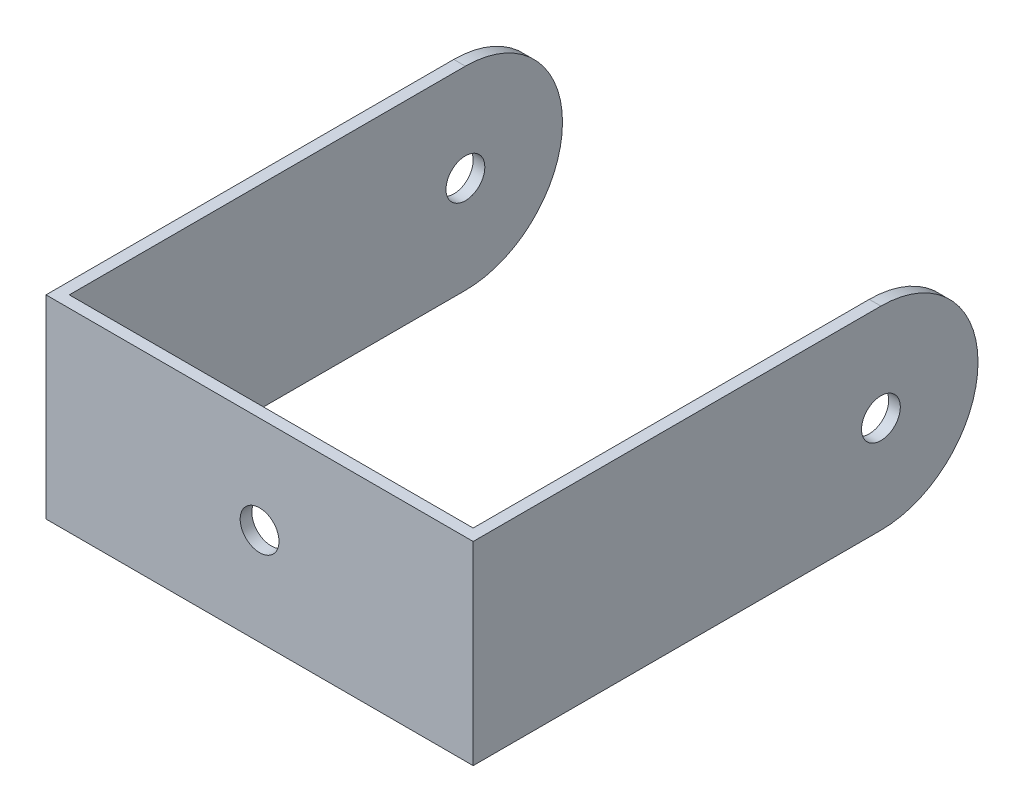
ISO-10303-21;
HEADER;
FILE_DESCRIPTION(('STEP AP214'),'2;1');
FILE_NAME('part.step','',(''),(''),'','','');
FILE_SCHEMA(('AUTOMOTIVE_DESIGN { 1 0 10303 214 1 1 1 1 }'));
ENDSEC;
DATA;
#1=APPLICATION_CONTEXT('core data for automotive mechanical design processes');
#2=APPLICATION_PROTOCOL_DEFINITION('international standard','automotive_design',2000,#1);
#3=PRODUCT_CONTEXT('',#1,'mechanical');
#4=PRODUCT('Part','Part','',(#3));
#5=PRODUCT_RELATED_PRODUCT_CATEGORY('part','',(#4));
#6=PRODUCT_DEFINITION_FORMATION('','',#4);
#7=PRODUCT_DEFINITION_CONTEXT('part definition',#1,'design');
#8=PRODUCT_DEFINITION('design','',#6,#7);
#9=PRODUCT_DEFINITION_SHAPE('','',#8);
#10=(LENGTH_UNIT() NAMED_UNIT(*) SI_UNIT(.MILLI.,.METRE.));
#11=(NAMED_UNIT(*) PLANE_ANGLE_UNIT() SI_UNIT($,.RADIAN.));
#12=(NAMED_UNIT(*) SI_UNIT($,.STERADIAN.) SOLID_ANGLE_UNIT());
#13=UNCERTAINTY_MEASURE_WITH_UNIT(LENGTH_MEASURE(1.E-05),#10,'distance_accuracy_value','');
#14=(GEOMETRIC_REPRESENTATION_CONTEXT(3) GLOBAL_UNCERTAINTY_ASSIGNED_CONTEXT((#13)) GLOBAL_UNIT_ASSIGNED_CONTEXT((#10,
#11,#12)) REPRESENTATION_CONTEXT('',''));
#15=CARTESIAN_POINT('',(0.,0.,0.));
#16=DIRECTION('',(0.,0.,1.));
#17=DIRECTION('',(1.,0.,0.));
#18=AXIS2_PLACEMENT_3D('',#15,#16,#17);
#19=CARTESIAN_POINT('',(-27.5,12.5,32.5));
#20=DIRECTION('',(1.,0.,0.));
#21=DIRECTION('',(0.,0.,-1.));
#22=AXIS2_PLACEMENT_3D('',#19,#20,#21);
#23=PLANE('',#22);
#24=CARTESIAN_POINT('',(-27.5,0.,-20.));
#25=DIRECTION('',(1.,0.,0.));
#26=DIRECTION('',(0.,0.,-1.));
#27=AXIS2_PLACEMENT_3D('',#24,#25,#26);
#28=CIRCLE('',#27,2.5);
#29=CARTESIAN_POINT('',(-27.5,0.,-22.5));
#30=VERTEX_POINT('',#29);
#31=EDGE_CURVE('E193',#30,#30,#28,.T.);
#32=ORIENTED_EDGE('',*,*,#31,.T.);
#33=EDGE_LOOP('',(#32));
#34=FACE_BOUND('',#33,.T.);
#35=CARTESIAN_POINT('',(-27.5,0.,-20.));
#36=DIRECTION('',(1.,0.,0.));
#37=DIRECTION('',(0.,0.,-1.));
#38=AXIS2_PLACEMENT_3D('',#35,#36,#37);
#39=CIRCLE('',#38,12.5);
#40=CARTESIAN_POINT('',(-27.5,12.5,-20.));
#41=VERTEX_POINT('',#40);
#42=CARTESIAN_POINT('',(-27.5,0.,-32.5));
#43=VERTEX_POINT('',#42);
#44=EDGE_CURVE('E130',#41,#43,#39,.F.);
#45=ORIENTED_EDGE('',*,*,#44,.T.);
#46=CARTESIAN_POINT('',(-27.5,0.,-20.));
#47=DIRECTION('',(1.,0.,0.));
#48=DIRECTION('',(0.,0.,-1.));
#49=AXIS2_PLACEMENT_3D('',#46,#47,#48);
#50=CIRCLE('',#49,12.5);
#51=CARTESIAN_POINT('',(-27.5,-12.5,-20.));
#52=VERTEX_POINT('',#51);
#53=EDGE_CURVE('E167',#43,#52,#50,.F.);
#54=ORIENTED_EDGE('',*,*,#53,.T.);
#55=DIRECTION('',(0.,0.,1.));
#56=VECTOR('',#55,1.);
#57=CARTESIAN_POINT('',(-27.5,-12.5,32.5));
#58=LINE('',#57,#56);
#59=CARTESIAN_POINT('',(-27.5,-12.5,32.5));
#60=VERTEX_POINT('',#59);
#61=EDGE_CURVE('E127',#52,#60,#58,.T.);
#62=ORIENTED_EDGE('',*,*,#61,.T.);
#63=DIRECTION('',(0.,-1.,0.));
#64=VECTOR('',#63,1.);
#65=CARTESIAN_POINT('',(-27.5,12.5,32.5));
#66=LINE('',#65,#64);
#67=CARTESIAN_POINT('',(-27.5,12.5,32.5));
#68=VERTEX_POINT('',#67);
#69=EDGE_CURVE('E125',#68,#60,#66,.T.);
#70=ORIENTED_EDGE('',*,*,#69,.F.);
#71=DIRECTION('',(0.,0.,1.));
#72=VECTOR('',#71,1.);
#73=CARTESIAN_POINT('',(-27.5,12.5,32.5));
#74=LINE('',#73,#72);
#75=EDGE_CURVE('E110',#41,#68,#74,.T.);
#76=ORIENTED_EDGE('',*,*,#75,.F.);
#77=EDGE_LOOP('',(#45,#54,#62,#70,#76));
#78=FACE_BOUND('',#77,.T.);
#79=ADVANCED_FACE('F33',(#34,#78),#23,.F.);
#80=CARTESIAN_POINT('',(27.5,12.5,32.5));
#81=DIRECTION('',(0.,0.,-1.));
#82=DIRECTION('',(-1.,0.,0.));
#83=AXIS2_PLACEMENT_3D('',#80,#81,#82);
#84=PLANE('',#83);
#85=CARTESIAN_POINT('',(0.,0.,32.5));
#86=DIRECTION('',(0.,0.,1.));
#87=DIRECTION('',(1.,0.,0.));
#88=AXIS2_PLACEMENT_3D('',#85,#86,#87);
#89=CIRCLE('',#88,2.5);
#90=CARTESIAN_POINT('',(2.5,0.,32.5));
#91=VERTEX_POINT('',#90);
#92=EDGE_CURVE('E205',#91,#91,#89,.T.);
#93=ORIENTED_EDGE('',*,*,#92,.F.);
#94=EDGE_LOOP('',(#93));
#95=FACE_BOUND('',#94,.T.);
#96=DIRECTION('',(1.,0.,0.));
#97=VECTOR('',#96,1.);
#98=CARTESIAN_POINT('',(27.5,-12.5,32.5));
#99=LINE('',#98,#97);
#100=CARTESIAN_POINT('',(27.5,-12.5,32.5));
#101=VERTEX_POINT('',#100);
#102=EDGE_CURVE('E149',#60,#101,#99,.T.);
#103=ORIENTED_EDGE('',*,*,#102,.T.);
#104=DIRECTION('',(0.,-1.,0.));
#105=VECTOR('',#104,1.);
#106=CARTESIAN_POINT('',(27.5,12.5,32.5));
#107=LINE('',#106,#105);
#108=CARTESIAN_POINT('',(27.5,12.5,32.5));
#109=VERTEX_POINT('',#108);
#110=EDGE_CURVE('E131',#109,#101,#107,.T.);
#111=ORIENTED_EDGE('',*,*,#110,.F.);
#112=DIRECTION('',(1.,0.,0.));
#113=VECTOR('',#112,1.);
#114=CARTESIAN_POINT('',(27.5,12.5,32.5));
#115=LINE('',#114,#113);
#116=EDGE_CURVE('E116',#68,#109,#115,.T.);
#117=ORIENTED_EDGE('',*,*,#116,.F.);
#118=ORIENTED_EDGE('',*,*,#69,.T.);
#119=EDGE_LOOP('',(#103,#111,#117,#118));
#120=FACE_BOUND('',#119,.T.);
#121=ADVANCED_FACE('F133',(#95,#120),#84,.F.);
#122=CARTESIAN_POINT('',(27.5,12.5,32.5));
#123=DIRECTION('',(-1.,0.,0.));
#124=DIRECTION('',(0.,0.,1.));
#125=AXIS2_PLACEMENT_3D('',#122,#123,#124);
#126=PLANE('',#125);
#127=CARTESIAN_POINT('',(27.5,0.,-20.));
#128=DIRECTION('',(1.,0.,0.));
#129=DIRECTION('',(0.,0.,-1.));
#130=AXIS2_PLACEMENT_3D('',#127,#128,#129);
#131=CIRCLE('',#130,2.5);
#132=CARTESIAN_POINT('',(27.5,0.,-22.5));
#133=VERTEX_POINT('',#132);
#134=EDGE_CURVE('E198',#133,#133,#131,.T.);
#135=ORIENTED_EDGE('',*,*,#134,.F.);
#136=EDGE_LOOP('',(#135));
#137=FACE_BOUND('',#136,.T.);
#138=DIRECTION('',(0.,0.,-1.));
#139=VECTOR('',#138,1.);
#140=CARTESIAN_POINT('',(27.5,-12.5,32.5));
#141=LINE('',#140,#139);
#142=CARTESIAN_POINT('',(27.5,-12.5,-20.));
#143=VERTEX_POINT('',#142);
#144=EDGE_CURVE('E152',#101,#143,#141,.T.);
#145=ORIENTED_EDGE('',*,*,#144,.T.);
#146=CARTESIAN_POINT('',(27.5,0.,-20.));
#147=DIRECTION('',(-1.,0.,0.));
#148=DIRECTION('',(0.,0.,1.));
#149=AXIS2_PLACEMENT_3D('',#146,#147,#148);
#150=CIRCLE('',#149,12.5);
#151=CARTESIAN_POINT('',(27.5,0.,-32.5));
#152=VERTEX_POINT('',#151);
#153=EDGE_CURVE('E11',#143,#152,#150,.F.);
#154=ORIENTED_EDGE('',*,*,#153,.T.);
#155=CARTESIAN_POINT('',(27.5,0.,-20.));
#156=DIRECTION('',(-1.,0.,0.));
#157=DIRECTION('',(0.,0.,1.));
#158=AXIS2_PLACEMENT_3D('',#155,#156,#157);
#159=CIRCLE('',#158,12.5);
#160=CARTESIAN_POINT('',(27.5,12.5,-20.));
#161=VERTEX_POINT('',#160);
#162=EDGE_CURVE('E42',#152,#161,#159,.F.);
#163=ORIENTED_EDGE('',*,*,#162,.T.);
#164=DIRECTION('',(0.,0.,-1.));
#165=VECTOR('',#164,1.);
#166=CARTESIAN_POINT('',(27.5,12.5,32.5));
#167=LINE('',#166,#165);
#168=EDGE_CURVE('E136',#109,#161,#167,.T.);
#169=ORIENTED_EDGE('',*,*,#168,.F.);
#170=ORIENTED_EDGE('',*,*,#110,.T.);
#171=EDGE_LOOP('',(#145,#154,#163,#169,#170));
#172=FACE_BOUND('',#171,.T.);
#173=ADVANCED_FACE('F231',(#137,#172),#126,.F.);
#174=CARTESIAN_POINT('',(26.,12.5,31.));
#175=DIRECTION('',(1.,0.,0.));
#176=DIRECTION('',(0.,0.,-1.));
#177=AXIS2_PLACEMENT_3D('',#174,#175,#176);
#178=PLANE('',#177);
#179=CARTESIAN_POINT('',(26.,0.,-20.));
#180=DIRECTION('',(1.,0.,0.));
#181=DIRECTION('',(0.,0.,-1.));
#182=AXIS2_PLACEMENT_3D('',#179,#180,#181);
#183=CIRCLE('',#182,2.5);
#184=CARTESIAN_POINT('',(26.,0.,-22.5));
#185=VERTEX_POINT('',#184);
#186=EDGE_CURVE('E190',#185,#185,#183,.T.);
#187=ORIENTED_EDGE('',*,*,#186,.T.);
#188=EDGE_LOOP('',(#187));
#189=FACE_BOUND('',#188,.T.);
#190=CARTESIAN_POINT('',(26.,0.,-20.));
#191=DIRECTION('',(1.,0.,0.));
#192=DIRECTION('',(0.,0.,-1.));
#193=AXIS2_PLACEMENT_3D('',#190,#191,#192);
#194=CIRCLE('',#193,12.5);
#195=CARTESIAN_POINT('',(26.,12.5,-20.));
#196=VERTEX_POINT('',#195);
#197=CARTESIAN_POINT('',(26.,0.,-32.5));
#198=VERTEX_POINT('',#197);
#199=EDGE_CURVE('E56',#196,#198,#194,.F.);
#200=ORIENTED_EDGE('',*,*,#199,.T.);
#201=CARTESIAN_POINT('',(26.,0.,-20.));
#202=DIRECTION('',(1.,0.,0.));
#203=DIRECTION('',(0.,0.,-1.));
#204=AXIS2_PLACEMENT_3D('',#201,#202,#203);
#205=CIRCLE('',#204,12.5);
#206=CARTESIAN_POINT('',(26.,-12.5,-20.));
#207=VERTEX_POINT('',#206);
#208=EDGE_CURVE('E183',#198,#207,#205,.F.);
#209=ORIENTED_EDGE('',*,*,#208,.T.);
#210=DIRECTION('',(0.,0.,1.));
#211=VECTOR('',#210,1.);
#212=CARTESIAN_POINT('',(26.,-12.5,31.));
#213=LINE('',#212,#211);
#214=CARTESIAN_POINT('',(26.,-12.5,31.));
#215=VERTEX_POINT('',#214);
#216=EDGE_CURVE('E154',#207,#215,#213,.T.);
#217=ORIENTED_EDGE('',*,*,#216,.T.);
#218=DIRECTION('',(0.,-1.,0.));
#219=VECTOR('',#218,1.);
#220=CARTESIAN_POINT('',(26.,12.5,31.));
#221=LINE('',#220,#219);
#222=CARTESIAN_POINT('',(26.,12.5,31.));
#223=VERTEX_POINT('',#222);
#224=EDGE_CURVE('E162',#223,#215,#221,.T.);
#225=ORIENTED_EDGE('',*,*,#224,.F.);
#226=DIRECTION('',(0.,0.,1.));
#227=VECTOR('',#226,1.);
#228=CARTESIAN_POINT('',(26.,12.5,31.));
#229=LINE('',#228,#227);
#230=EDGE_CURVE('E138',#196,#223,#229,.T.);
#231=ORIENTED_EDGE('',*,*,#230,.F.);
#232=EDGE_LOOP('',(#200,#209,#217,#225,#231));
#233=FACE_BOUND('',#232,.T.);
#234=ADVANCED_FACE('F260',(#189,#233),#178,.F.);
#235=CARTESIAN_POINT('',(26.,12.5,31.));
#236=DIRECTION('',(0.,0.,1.));
#237=DIRECTION('',(1.,0.,0.));
#238=AXIS2_PLACEMENT_3D('',#235,#236,#237);
#239=PLANE('',#238);
#240=CARTESIAN_POINT('',(0.,0.,31.));
#241=DIRECTION('',(0.,0.,1.));
#242=DIRECTION('',(1.,0.,0.));
#243=AXIS2_PLACEMENT_3D('',#240,#241,#242);
#244=CIRCLE('',#243,2.5);
#245=CARTESIAN_POINT('',(2.5,0.,31.));
#246=VERTEX_POINT('',#245);
#247=EDGE_CURVE('E37',#246,#246,#244,.T.);
#248=ORIENTED_EDGE('',*,*,#247,.T.);
#249=EDGE_LOOP('',(#248));
#250=FACE_BOUND('',#249,.T.);
#251=DIRECTION('',(-1.,0.,0.));
#252=VECTOR('',#251,1.);
#253=CARTESIAN_POINT('',(26.,-12.5,31.));
#254=LINE('',#253,#252);
#255=CARTESIAN_POINT('',(-26.,-12.5,31.));
#256=VERTEX_POINT('',#255);
#257=EDGE_CURVE('E156',#215,#256,#254,.T.);
#258=ORIENTED_EDGE('',*,*,#257,.T.);
#259=DIRECTION('',(0.,-1.,0.));
#260=VECTOR('',#259,1.);
#261=CARTESIAN_POINT('',(-26.,12.5,31.));
#262=LINE('',#261,#260);
#263=CARTESIAN_POINT('',(-26.,12.5,31.));
#264=VERTEX_POINT('',#263);
#265=EDGE_CURVE('E147',#264,#256,#262,.T.);
#266=ORIENTED_EDGE('',*,*,#265,.F.);
#267=DIRECTION('',(-1.,0.,0.));
#268=VECTOR('',#267,1.);
#269=CARTESIAN_POINT('',(26.,12.5,31.));
#270=LINE('',#269,#268);
#271=EDGE_CURVE('E143',#223,#264,#270,.T.);
#272=ORIENTED_EDGE('',*,*,#271,.F.);
#273=ORIENTED_EDGE('',*,*,#224,.T.);
#274=EDGE_LOOP('',(#258,#266,#272,#273));
#275=FACE_BOUND('',#274,.T.);
#276=ADVANCED_FACE('F212',(#250,#275),#239,.F.);
#277=CARTESIAN_POINT('',(-26.,12.5,31.));
#278=DIRECTION('',(-1.,0.,0.));
#279=DIRECTION('',(0.,0.,1.));
#280=AXIS2_PLACEMENT_3D('',#277,#278,#279);
#281=PLANE('',#280);
#282=CARTESIAN_POINT('',(-26.,0.,-20.));
#283=DIRECTION('',(-1.,0.,0.));
#284=DIRECTION('',(0.,0.,1.));
#285=AXIS2_PLACEMENT_3D('',#282,#283,#284);
#286=CIRCLE('',#285,2.5);
#287=CARTESIAN_POINT('',(-26.,0.,-17.5));
#288=VERTEX_POINT('',#287);
#289=EDGE_CURVE('E191',#288,#288,#286,.T.);
#290=ORIENTED_EDGE('',*,*,#289,.T.);
#291=EDGE_LOOP('',(#290));
#292=FACE_BOUND('',#291,.T.);
#293=DIRECTION('',(0.,0.,-1.));
#294=VECTOR('',#293,1.);
#295=CARTESIAN_POINT('',(-26.,-12.5,31.));
#296=LINE('',#295,#294);
#297=CARTESIAN_POINT('',(-26.,-12.5,-20.));
#298=VERTEX_POINT('',#297);
#299=EDGE_CURVE('E122',#256,#298,#296,.T.);
#300=ORIENTED_EDGE('',*,*,#299,.T.);
#301=CARTESIAN_POINT('',(-26.,0.,-20.));
#302=DIRECTION('',(-1.,0.,0.));
#303=DIRECTION('',(0.,0.,1.));
#304=AXIS2_PLACEMENT_3D('',#301,#302,#303);
#305=CIRCLE('',#304,12.5);
#306=CARTESIAN_POINT('',(-26.,0.,-32.5));
#307=VERTEX_POINT('',#306);
#308=EDGE_CURVE('E177',#298,#307,#305,.F.);
#309=ORIENTED_EDGE('',*,*,#308,.T.);
#310=CARTESIAN_POINT('',(-26.,0.,-20.));
#311=DIRECTION('',(-1.,0.,0.));
#312=DIRECTION('',(0.,0.,1.));
#313=AXIS2_PLACEMENT_3D('',#310,#311,#312);
#314=CIRCLE('',#313,12.5);
#315=CARTESIAN_POINT('',(-26.,12.5,-20.));
#316=VERTEX_POINT('',#315);
#317=EDGE_CURVE('E175',#307,#316,#314,.F.);
#318=ORIENTED_EDGE('',*,*,#317,.T.);
#319=DIRECTION('',(0.,0.,-1.));
#320=VECTOR('',#319,1.);
#321=CARTESIAN_POINT('',(-26.,12.5,31.));
#322=LINE('',#321,#320);
#323=EDGE_CURVE('E145',#264,#316,#322,.T.);
#324=ORIENTED_EDGE('',*,*,#323,.F.);
#325=ORIENTED_EDGE('',*,*,#265,.T.);
#326=EDGE_LOOP('',(#300,#309,#318,#324,#325));
#327=FACE_BOUND('',#326,.T.);
#328=ADVANCED_FACE('F267',(#292,#327),#281,.F.);
#329=CARTESIAN_POINT('',(0.,12.5,0.));
#330=DIRECTION('',(0.,1.,0.));
#331=DIRECTION('',(0.,0.,1.));
#332=AXIS2_PLACEMENT_3D('',#329,#330,#331);
#333=PLANE('',#332);
#334=ORIENTED_EDGE('',*,*,#323,.T.);
#335=DIRECTION('',(-1.,0.,0.));
#336=VECTOR('',#335,1.);
#337=CARTESIAN_POINT('',(-27.5,12.5,-20.));
#338=LINE('',#337,#336);
#339=EDGE_CURVE('E119',#316,#41,#338,.T.);
#340=ORIENTED_EDGE('',*,*,#339,.T.);
#341=ORIENTED_EDGE('',*,*,#75,.T.);
#342=ORIENTED_EDGE('',*,*,#116,.T.);
#343=ORIENTED_EDGE('',*,*,#168,.T.);
#344=DIRECTION('',(-1.,0.,0.));
#345=VECTOR('',#344,1.);
#346=CARTESIAN_POINT('',(26.,12.5,-20.));
#347=LINE('',#346,#345);
#348=EDGE_CURVE('E179',#161,#196,#347,.T.);
#349=ORIENTED_EDGE('',*,*,#348,.T.);
#350=ORIENTED_EDGE('',*,*,#230,.T.);
#351=ORIENTED_EDGE('',*,*,#271,.T.);
#352=EDGE_LOOP('',(#334,#340,#341,#342,#343,#349,#350,#351));
#353=FACE_BOUND('',#352,.T.);
#354=ADVANCED_FACE('F113',(#353),#333,.T.);
#355=CARTESIAN_POINT('',(0.,-12.5,0.));
#356=DIRECTION('',(0.,1.,0.));
#357=DIRECTION('',(0.,0.,1.));
#358=AXIS2_PLACEMENT_3D('',#355,#356,#357);
#359=PLANE('',#358);
#360=ORIENTED_EDGE('',*,*,#61,.F.);
#361=DIRECTION('',(-1.,0.,0.));
#362=VECTOR('',#361,1.);
#363=CARTESIAN_POINT('',(0.,-12.5,-20.));
#364=LINE('',#363,#362);
#365=EDGE_CURVE('E172',#52,#298,#364,.F.);
#366=ORIENTED_EDGE('',*,*,#365,.T.);
#367=ORIENTED_EDGE('',*,*,#299,.F.);
#368=ORIENTED_EDGE('',*,*,#257,.F.);
#369=ORIENTED_EDGE('',*,*,#216,.F.);
#370=DIRECTION('',(-1.,0.,0.));
#371=VECTOR('',#370,1.);
#372=CARTESIAN_POINT('',(0.,-12.5,-20.));
#373=LINE('',#372,#371);
#374=EDGE_CURVE('E169',#207,#143,#373,.F.);
#375=ORIENTED_EDGE('',*,*,#374,.T.);
#376=ORIENTED_EDGE('',*,*,#144,.F.);
#377=ORIENTED_EDGE('',*,*,#102,.F.);
#378=EDGE_LOOP('',(#360,#366,#367,#368,#369,#375,#376,#377));
#379=FACE_BOUND('',#378,.T.);
#380=ADVANCED_FACE('F242',(#379),#359,.F.);
#381=CARTESIAN_POINT('',(0.,0.,-20.));
#382=DIRECTION('',(1.,0.,0.));
#383=DIRECTION('',(0.,0.,-1.));
#384=AXIS2_PLACEMENT_3D('',#381,#382,#383);
#385=CYLINDRICAL_SURFACE('',#384,12.5);
#386=ORIENTED_EDGE('',*,*,#339,.F.);
#387=ORIENTED_EDGE('',*,*,#317,.F.);
#388=DIRECTION('',(-1.,0.,0.));
#389=VECTOR('',#388,1.);
#390=CARTESIAN_POINT('',(-26.,0.,-32.5));
#391=LINE('',#390,#389);
#392=EDGE_CURVE('E150',#43,#307,#391,.F.);
#393=ORIENTED_EDGE('',*,*,#392,.F.);
#394=ORIENTED_EDGE('',*,*,#44,.F.);
#395=EDGE_LOOP('',(#386,#387,#393,#394));
#396=FACE_BOUND('',#395,.T.);
#397=ADVANCED_FACE('F239',(#396),#385,.T.);
#398=CARTESIAN_POINT('',(-27.5,0.,-20.));
#399=DIRECTION('',(-1.,0.,0.));
#400=DIRECTION('',(0.,0.,1.));
#401=AXIS2_PLACEMENT_3D('',#398,#399,#400);
#402=CYLINDRICAL_SURFACE('',#401,12.5);
#403=ORIENTED_EDGE('',*,*,#308,.F.);
#404=ORIENTED_EDGE('',*,*,#365,.F.);
#405=ORIENTED_EDGE('',*,*,#53,.F.);
#406=ORIENTED_EDGE('',*,*,#392,.T.);
#407=EDGE_LOOP('',(#403,#404,#405,#406));
#408=FACE_BOUND('',#407,.T.);
#409=ADVANCED_FACE('F236',(#408),#402,.T.);
#410=CARTESIAN_POINT('',(0.,0.,-20.));
#411=DIRECTION('',(1.,0.,0.));
#412=DIRECTION('',(0.,0.,-1.));
#413=AXIS2_PLACEMENT_3D('',#410,#411,#412);
#414=CYLINDRICAL_SURFACE('',#413,12.5);
#415=ORIENTED_EDGE('',*,*,#348,.F.);
#416=ORIENTED_EDGE('',*,*,#162,.F.);
#417=DIRECTION('',(-1.,0.,0.));
#418=VECTOR('',#417,1.);
#419=CARTESIAN_POINT('',(27.5,0.,-32.5));
#420=LINE('',#419,#418);
#421=EDGE_CURVE('E188',#198,#152,#420,.F.);
#422=ORIENTED_EDGE('',*,*,#421,.F.);
#423=ORIENTED_EDGE('',*,*,#199,.F.);
#424=EDGE_LOOP('',(#415,#416,#422,#423));
#425=FACE_BOUND('',#424,.T.);
#426=ADVANCED_FACE('F35',(#425),#414,.T.);
#427=CARTESIAN_POINT('',(26.,0.,-20.));
#428=DIRECTION('',(-1.,0.,0.));
#429=DIRECTION('',(0.,0.,1.));
#430=AXIS2_PLACEMENT_3D('',#427,#428,#429);
#431=CYLINDRICAL_SURFACE('',#430,12.5);
#432=ORIENTED_EDGE('',*,*,#153,.F.);
#433=ORIENTED_EDGE('',*,*,#374,.F.);
#434=ORIENTED_EDGE('',*,*,#208,.F.);
#435=ORIENTED_EDGE('',*,*,#421,.T.);
#436=EDGE_LOOP('',(#432,#433,#434,#435));
#437=FACE_BOUND('',#436,.T.);
#438=ADVANCED_FACE('F244',(#437),#431,.T.);
#439=CARTESIAN_POINT('',(-27.5,0.,-20.));
#440=DIRECTION('',(1.,0.,0.));
#441=DIRECTION('',(0.,0.,-1.));
#442=AXIS2_PLACEMENT_3D('',#439,#440,#441);
#443=CYLINDRICAL_SURFACE('',#442,2.5);
#444=ORIENTED_EDGE('',*,*,#31,.F.);
#445=EDGE_LOOP('',(#444));
#446=FACE_BOUND('',#445,.T.);
#447=ORIENTED_EDGE('',*,*,#289,.F.);
#448=EDGE_LOOP('',(#447));
#449=FACE_BOUND('',#448,.T.);
#450=ADVANCED_FACE('F222',(#446,#449),#443,.F.);
#451=ORIENTED_EDGE('',*,*,#134,.T.);
#452=EDGE_LOOP('',(#451));
#453=FACE_BOUND('',#452,.T.);
#454=ORIENTED_EDGE('',*,*,#186,.F.);
#455=EDGE_LOOP('',(#454));
#456=FACE_BOUND('',#455,.T.);
#457=ADVANCED_FACE('F217',(#453,#456),#443,.F.);
#458=CARTESIAN_POINT('',(0.,0.,22.5));
#459=DIRECTION('',(0.,0.,1.));
#460=DIRECTION('',(1.,0.,0.));
#461=AXIS2_PLACEMENT_3D('',#458,#459,#460);
#462=CYLINDRICAL_SURFACE('',#461,2.5);
#463=ORIENTED_EDGE('',*,*,#92,.T.);
#464=EDGE_LOOP('',(#463));
#465=FACE_BOUND('',#464,.T.);
#466=ORIENTED_EDGE('',*,*,#247,.F.);
#467=EDGE_LOOP('',(#466));
#468=FACE_BOUND('',#467,.T.);
#469=ADVANCED_FACE('F215',(#465,#468),#462,.F.);
#470=CLOSED_SHELL('',(#79,#121,#173,#234,#276,#328,#354,#380,#397,#409,#426,#438,#450,#457,#469));
#471=MANIFOLD_SOLID_BREP('B2',#470);
#472=ADVANCED_BREP_SHAPE_REPRESENTATION('',(#18,#471),#14);
#473=SHAPE_DEFINITION_REPRESENTATION(#9,#472);
ENDSEC;
END-ISO-10303-21;
